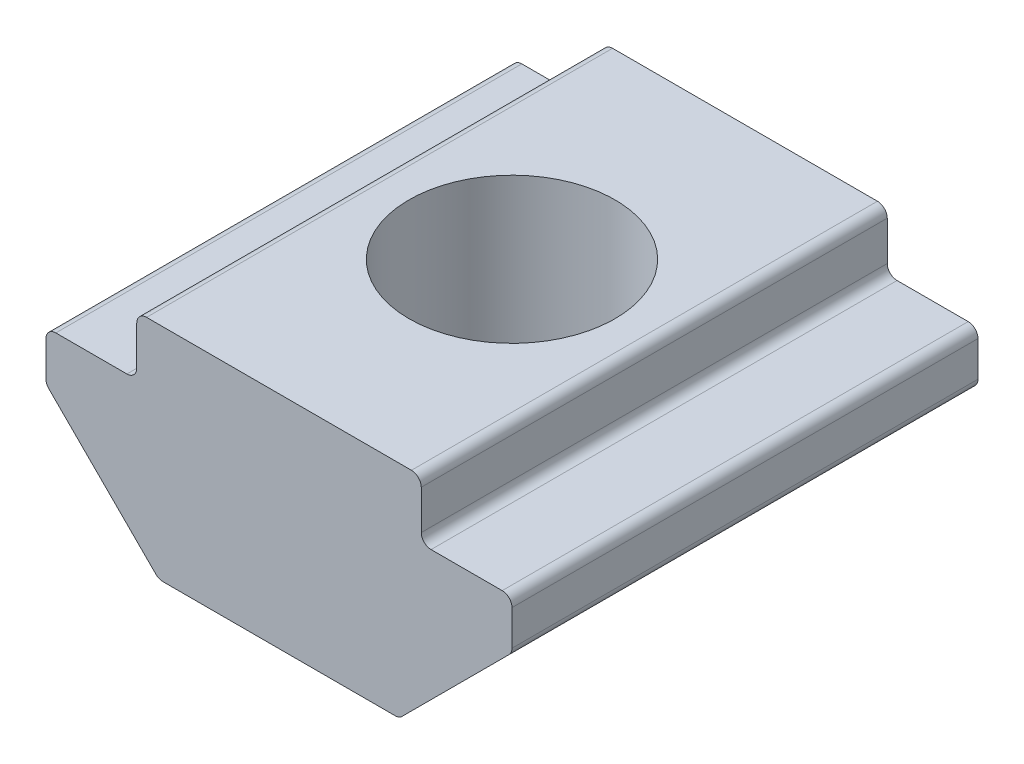
ISO-10303-21;
HEADER;
FILE_DESCRIPTION(('STEP AP214'),'2;1');
FILE_NAME('part.step','',(''),(''),'','','');
FILE_SCHEMA(('AUTOMOTIVE_DESIGN { 1 0 10303 214 1 1 1 1 }'));
ENDSEC;
DATA;
#1=APPLICATION_CONTEXT('core data for automotive mechanical design processes');
#2=APPLICATION_PROTOCOL_DEFINITION('international standard','automotive_design',2000,#1);
#3=PRODUCT_CONTEXT('',#1,'mechanical');
#4=PRODUCT('Part','Part','',(#3));
#5=PRODUCT_RELATED_PRODUCT_CATEGORY('part','',(#4));
#6=PRODUCT_DEFINITION_FORMATION('','',#4);
#7=PRODUCT_DEFINITION_CONTEXT('part definition',#1,'design');
#8=PRODUCT_DEFINITION('design','',#6,#7);
#9=PRODUCT_DEFINITION_SHAPE('','',#8);
#10=(LENGTH_UNIT() NAMED_UNIT(*) SI_UNIT(.MILLI.,.METRE.));
#11=(NAMED_UNIT(*) PLANE_ANGLE_UNIT() SI_UNIT($,.RADIAN.));
#12=(NAMED_UNIT(*) SI_UNIT($,.STERADIAN.) SOLID_ANGLE_UNIT());
#13=UNCERTAINTY_MEASURE_WITH_UNIT(LENGTH_MEASURE(1.E-05),#10,'distance_accuracy_value','');
#14=(GEOMETRIC_REPRESENTATION_CONTEXT(3) GLOBAL_UNCERTAINTY_ASSIGNED_CONTEXT((#13)) GLOBAL_UNIT_ASSIGNED_CONTEXT((#10,
#11,#12)) REPRESENTATION_CONTEXT('',''));
#15=CARTESIAN_POINT('',(0.,0.,0.));
#16=DIRECTION('',(0.,0.,1.));
#17=DIRECTION('',(1.,0.,0.));
#18=AXIS2_PLACEMENT_3D('',#15,#16,#17);
#19=CARTESIAN_POINT('',(-2.9,0.,4.75));
#20=DIRECTION('',(1.,0.,0.));
#21=DIRECTION('',(0.,1.,0.));
#22=AXIS2_PLACEMENT_3D('',#19,#20,#21);
#23=PLANE('',#22);
#24=DIRECTION('',(0.,-1.,0.));
#25=VECTOR('',#24,1.);
#26=CARTESIAN_POINT('',(-2.9,0.,-4.75));
#27=LINE('',#26,#25);
#28=CARTESIAN_POINT('',(-2.9,-0.2,-4.75));
#29=VERTEX_POINT('',#28);
#30=CARTESIAN_POINT('',(-2.9,-1.,-4.75));
#31=VERTEX_POINT('',#30);
#32=EDGE_CURVE('E183',#29,#31,#27,.T.);
#33=ORIENTED_EDGE('',*,*,#32,.T.);
#34=DIRECTION('',(0.,0.,-1.));
#35=VECTOR('',#34,1.);
#36=CARTESIAN_POINT('',(-2.9,-1.,4.75));
#37=LINE('',#36,#35);
#38=CARTESIAN_POINT('',(-2.9,-1.,4.75));
#39=VERTEX_POINT('',#38);
#40=EDGE_CURVE('E160',#31,#39,#37,.F.);
#41=ORIENTED_EDGE('',*,*,#40,.T.);
#42=DIRECTION('',(0.,-1.,0.));
#43=VECTOR('',#42,1.);
#44=CARTESIAN_POINT('',(-2.9,0.,4.75));
#45=LINE('',#44,#43);
#46=CARTESIAN_POINT('',(-2.9,-0.2,4.75));
#47=VERTEX_POINT('',#46);
#48=EDGE_CURVE('E211',#47,#39,#45,.T.);
#49=ORIENTED_EDGE('',*,*,#48,.F.);
#50=DIRECTION('',(0.,0.,-1.));
#51=VECTOR('',#50,1.);
#52=CARTESIAN_POINT('',(-2.9,-0.2,4.75));
#53=LINE('',#52,#51);
#54=EDGE_CURVE('E175',#47,#29,#53,.T.);
#55=ORIENTED_EDGE('',*,*,#54,.T.);
#56=EDGE_LOOP('',(#33,#41,#49,#55));
#57=FACE_BOUND('',#56,.T.);
#58=ADVANCED_FACE('F17',(#57),#23,.F.);
#59=CARTESIAN_POINT('',(-2.9,-1.2,4.75));
#60=DIRECTION('',(0.,-1.,0.));
#61=DIRECTION('',(1.,0.,0.));
#62=AXIS2_PLACEMENT_3D('',#59,#60,#61);
#63=PLANE('',#62);
#64=DIRECTION('',(-1.,0.,0.));
#65=VECTOR('',#64,1.);
#66=CARTESIAN_POINT('',(-2.9,-1.2,4.75));
#67=LINE('',#66,#65);
#68=CARTESIAN_POINT('',(-3.1,-1.2,4.75));
#69=VERTEX_POINT('',#68);
#70=CARTESIAN_POINT('',(-4.55,-1.2,4.75));
#71=VERTEX_POINT('',#70);
#72=EDGE_CURVE('E174',#69,#71,#67,.T.);
#73=ORIENTED_EDGE('',*,*,#72,.F.);
#74=DIRECTION('',(0.,0.,-1.));
#75=VECTOR('',#74,1.);
#76=CARTESIAN_POINT('',(-3.1,-1.2,-4.75));
#77=LINE('',#76,#75);
#78=CARTESIAN_POINT('',(-3.1,-1.2,-4.75));
#79=VERTEX_POINT('',#78);
#80=EDGE_CURVE('E159',#69,#79,#77,.T.);
#81=ORIENTED_EDGE('',*,*,#80,.T.);
#82=DIRECTION('',(-1.,0.,0.));
#83=VECTOR('',#82,1.);
#84=CARTESIAN_POINT('',(-2.9,-1.2,-4.75));
#85=LINE('',#84,#83);
#86=CARTESIAN_POINT('',(-4.55,-1.2,-4.75));
#87=VERTEX_POINT('',#86);
#88=EDGE_CURVE('E171',#79,#87,#85,.T.);
#89=ORIENTED_EDGE('',*,*,#88,.T.);
#90=DIRECTION('',(0.,0.,-1.));
#91=VECTOR('',#90,1.);
#92=CARTESIAN_POINT('',(-4.55,-1.2,4.75));
#93=LINE('',#92,#91);
#94=EDGE_CURVE('E176',#87,#71,#93,.F.);
#95=ORIENTED_EDGE('',*,*,#94,.T.);
#96=EDGE_LOOP('',(#73,#81,#89,#95));
#97=FACE_BOUND('',#96,.T.);
#98=ADVANCED_FACE('F170',(#97),#63,.F.);
#99=CARTESIAN_POINT('',(-4.75,-1.2,4.75));
#100=DIRECTION('',(1.,0.,0.));
#101=DIRECTION('',(0.,0.,-1.));
#102=AXIS2_PLACEMENT_3D('',#99,#100,#101);
#103=PLANE('',#102);
#104=DIRECTION('',(0.,-1.,0.));
#105=VECTOR('',#104,1.);
#106=CARTESIAN_POINT('',(-4.75,-1.2,-4.75));
#107=LINE('',#106,#105);
#108=CARTESIAN_POINT('',(-4.75,-1.4,-4.75));
#109=VERTEX_POINT('',#108);
#110=CARTESIAN_POINT('',(-4.75,-2.11715728752538,-4.75));
#111=VERTEX_POINT('',#110);
#112=EDGE_CURVE('E182',#109,#111,#107,.T.);
#113=ORIENTED_EDGE('',*,*,#112,.T.);
#114=DIRECTION('',(0.,0.,-1.));
#115=VECTOR('',#114,1.);
#116=CARTESIAN_POINT('',(-4.75,-2.11715728752538,4.75));
#117=LINE('',#116,#115);
#118=CARTESIAN_POINT('',(-4.75,-2.11715728752538,4.75));
#119=VERTEX_POINT('',#118);
#120=EDGE_CURVE('E250',#111,#119,#117,.F.);
#121=ORIENTED_EDGE('',*,*,#120,.T.);
#122=DIRECTION('',(0.,-1.,0.));
#123=VECTOR('',#122,1.);
#124=CARTESIAN_POINT('',(-4.75,-1.2,4.75));
#125=LINE('',#124,#123);
#126=CARTESIAN_POINT('',(-4.75,-1.4,4.75));
#127=VERTEX_POINT('',#126);
#128=EDGE_CURVE('E321',#127,#119,#125,.T.);
#129=ORIENTED_EDGE('',*,*,#128,.F.);
#130=DIRECTION('',(0.,0.,-1.));
#131=VECTOR('',#130,1.);
#132=CARTESIAN_POINT('',(-4.75,-1.4,4.75));
#133=LINE('',#132,#131);
#134=EDGE_CURVE('E247',#127,#109,#133,.T.);
#135=ORIENTED_EDGE('',*,*,#134,.T.);
#136=EDGE_LOOP('',(#113,#121,#129,#135));
#137=FACE_BOUND('',#136,.T.);
#138=ADVANCED_FACE('F352',(#137),#103,.F.);
#139=CARTESIAN_POINT('',(-4.75,-2.2,4.75));
#140=DIRECTION('',(0.707106781186546,0.707106781186549,0.));
#141=DIRECTION('',(-0.707106781186549,0.707106781186546,0.));
#142=AXIS2_PLACEMENT_3D('',#139,#140,#141);
#143=PLANE('',#142);
#144=DIRECTION('',(0.707106781186549,-0.707106781186546,0.));
#145=VECTOR('',#144,1.);
#146=CARTESIAN_POINT('',(-4.75,-2.2,4.75));
#147=LINE('',#146,#145);
#148=CARTESIAN_POINT('',(-4.69142135623731,-2.25857864376269,4.75));
#149=VERTEX_POINT('',#148);
#150=CARTESIAN_POINT('',(-2.50857864376268,-4.44142135623731,4.75));
#151=VERTEX_POINT('',#150);
#152=EDGE_CURVE('E318',#149,#151,#147,.T.);
#153=ORIENTED_EDGE('',*,*,#152,.F.);
#154=DIRECTION('',(0.,0.,-1.));
#155=VECTOR('',#154,1.);
#156=CARTESIAN_POINT('',(-4.69142135623731,-2.25857864376269,4.75));
#157=LINE('',#156,#155);
#158=CARTESIAN_POINT('',(-4.69142135623731,-2.25857864376269,-4.75));
#159=VERTEX_POINT('',#158);
#160=EDGE_CURVE('E229',#149,#159,#157,.T.);
#161=ORIENTED_EDGE('',*,*,#160,.T.);
#162=DIRECTION('',(0.707106781186549,-0.707106781186546,0.));
#163=VECTOR('',#162,1.);
#164=CARTESIAN_POINT('',(-4.75,-2.2,-4.75));
#165=LINE('',#164,#163);
#166=CARTESIAN_POINT('',(-2.50857864376268,-4.44142135623731,-4.75));
#167=VERTEX_POINT('',#166);
#168=EDGE_CURVE('E186',#159,#167,#165,.T.);
#169=ORIENTED_EDGE('',*,*,#168,.T.);
#170=DIRECTION('',(0.,0.,-1.));
#171=VECTOR('',#170,1.);
#172=CARTESIAN_POINT('',(-2.50857864376268,-4.44142135623731,4.75));
#173=LINE('',#172,#171);
#174=EDGE_CURVE('E227',#167,#151,#173,.F.);
#175=ORIENTED_EDGE('',*,*,#174,.T.);
#176=EDGE_LOOP('',(#153,#161,#169,#175));
#177=FACE_BOUND('',#176,.T.);
#178=ADVANCED_FACE('F528',(#177),#143,.F.);
#179=CARTESIAN_POINT('',(-2.45,-4.5,4.75));
#180=DIRECTION('',(0.,1.,0.));
#181=DIRECTION('',(-1.,0.,0.));
#182=AXIS2_PLACEMENT_3D('',#179,#180,#181);
#183=PLANE('',#182);
#184=CARTESIAN_POINT('',(0.,-4.5,0.));
#185=DIRECTION('',(0.,1.,0.));
#186=DIRECTION('',(0.,0.,1.));
#187=AXIS2_PLACEMENT_3D('',#184,#185,#186);
#188=CIRCLE('',#187,2.1);
#189=CARTESIAN_POINT('',(0.,-4.5,2.1));
#190=VERTEX_POINT('',#189);
#191=EDGE_CURVE('E188',#190,#190,#188,.T.);
#192=ORIENTED_EDGE('',*,*,#191,.T.);
#193=EDGE_LOOP('',(#192));
#194=FACE_BOUND('',#193,.T.);
#195=DIRECTION('',(1.,0.,0.));
#196=VECTOR('',#195,1.);
#197=CARTESIAN_POINT('',(-2.45,-4.5,4.75));
#198=LINE('',#197,#196);
#199=CARTESIAN_POINT('',(-2.36715728752537,-4.5,4.75));
#200=VERTEX_POINT('',#199);
#201=CARTESIAN_POINT('',(2.36715728752537,-4.5,4.75));
#202=VERTEX_POINT('',#201);
#203=EDGE_CURVE('E315',#200,#202,#198,.T.);
#204=ORIENTED_EDGE('',*,*,#203,.F.);
#205=DIRECTION('',(0.,0.,-1.));
#206=VECTOR('',#205,1.);
#207=CARTESIAN_POINT('',(-2.36715728752537,-4.5,4.75));
#208=LINE('',#207,#206);
#209=CARTESIAN_POINT('',(-2.36715728752537,-4.5,-4.75));
#210=VERTEX_POINT('',#209);
#211=EDGE_CURVE('E269',#200,#210,#208,.T.);
#212=ORIENTED_EDGE('',*,*,#211,.T.);
#213=DIRECTION('',(1.,0.,0.));
#214=VECTOR('',#213,1.);
#215=CARTESIAN_POINT('',(-2.45,-4.5,-4.75));
#216=LINE('',#215,#214);
#217=CARTESIAN_POINT('',(2.36715728752537,-4.5,-4.75));
#218=VERTEX_POINT('',#217);
#219=EDGE_CURVE('E194',#210,#218,#216,.T.);
#220=ORIENTED_EDGE('',*,*,#219,.T.);
#221=DIRECTION('',(0.,0.,-1.));
#222=VECTOR('',#221,1.);
#223=CARTESIAN_POINT('',(2.36715728752537,-4.5,4.75));
#224=LINE('',#223,#222);
#225=EDGE_CURVE('E267',#218,#202,#224,.F.);
#226=ORIENTED_EDGE('',*,*,#225,.T.);
#227=EDGE_LOOP('',(#204,#212,#220,#226));
#228=FACE_BOUND('',#227,.T.);
#229=ADVANCED_FACE('F518',(#194,#228),#183,.F.);
#230=CARTESIAN_POINT('',(4.75,-2.2,4.75));
#231=DIRECTION('',(-0.707106781186546,0.707106781186549,0.));
#232=DIRECTION('',(-0.707106781186549,-0.707106781186546,0.));
#233=AXIS2_PLACEMENT_3D('',#230,#231,#232);
#234=PLANE('',#233);
#235=DIRECTION('',(0.707106781186549,0.707106781186546,0.));
#236=VECTOR('',#235,1.);
#237=CARTESIAN_POINT('',(4.75,-2.2,4.75));
#238=LINE('',#237,#236);
#239=CARTESIAN_POINT('',(2.50857864376268,-4.44142135623731,4.75));
#240=VERTEX_POINT('',#239);
#241=CARTESIAN_POINT('',(4.69142135623731,-2.25857864376269,4.75));
#242=VERTEX_POINT('',#241);
#243=EDGE_CURVE('E312',#240,#242,#238,.T.);
#244=ORIENTED_EDGE('',*,*,#243,.F.);
#245=DIRECTION('',(0.,0.,-1.));
#246=VECTOR('',#245,1.);
#247=CARTESIAN_POINT('',(2.50857864376268,-4.44142135623731,4.75));
#248=LINE('',#247,#246);
#249=CARTESIAN_POINT('',(2.50857864376268,-4.44142135623731,-4.75));
#250=VERTEX_POINT('',#249);
#251=EDGE_CURVE('E274',#240,#250,#248,.T.);
#252=ORIENTED_EDGE('',*,*,#251,.T.);
#253=DIRECTION('',(0.707106781186549,0.707106781186546,0.));
#254=VECTOR('',#253,1.);
#255=CARTESIAN_POINT('',(4.75,-2.2,-4.75));
#256=LINE('',#255,#254);
#257=CARTESIAN_POINT('',(4.69142135623731,-2.25857864376269,-4.75));
#258=VERTEX_POINT('',#257);
#259=EDGE_CURVE('E197',#250,#258,#256,.T.);
#260=ORIENTED_EDGE('',*,*,#259,.T.);
#261=DIRECTION('',(0.,0.,-1.));
#262=VECTOR('',#261,1.);
#263=CARTESIAN_POINT('',(4.69142135623731,-2.25857864376269,4.75));
#264=LINE('',#263,#262);
#265=EDGE_CURVE('E272',#258,#242,#264,.F.);
#266=ORIENTED_EDGE('',*,*,#265,.T.);
#267=EDGE_LOOP('',(#244,#252,#260,#266));
#268=FACE_BOUND('',#267,.T.);
#269=ADVANCED_FACE('F508',(#268),#234,.F.);
#270=CARTESIAN_POINT('',(4.75,-1.2,4.75));
#271=DIRECTION('',(-1.,0.,0.));
#272=DIRECTION('',(0.,0.,1.));
#273=AXIS2_PLACEMENT_3D('',#270,#271,#272);
#274=PLANE('',#273);
#275=DIRECTION('',(0.,1.,0.));
#276=VECTOR('',#275,1.);
#277=CARTESIAN_POINT('',(4.75,-1.2,4.75));
#278=LINE('',#277,#276);
#279=CARTESIAN_POINT('',(4.75,-2.11715728752538,4.75));
#280=VERTEX_POINT('',#279);
#281=CARTESIAN_POINT('',(4.75,-1.4,4.75));
#282=VERTEX_POINT('',#281);
#283=EDGE_CURVE('E307',#280,#282,#278,.T.);
#284=ORIENTED_EDGE('',*,*,#283,.F.);
#285=DIRECTION('',(0.,0.,-1.));
#286=VECTOR('',#285,1.);
#287=CARTESIAN_POINT('',(4.75,-2.11715728752538,4.75));
#288=LINE('',#287,#286);
#289=CARTESIAN_POINT('',(4.75,-2.11715728752538,-4.75));
#290=VERTEX_POINT('',#289);
#291=EDGE_CURVE('E279',#280,#290,#288,.T.);
#292=ORIENTED_EDGE('',*,*,#291,.T.);
#293=DIRECTION('',(0.,1.,0.));
#294=VECTOR('',#293,1.);
#295=CARTESIAN_POINT('',(4.75,-1.2,-4.75));
#296=LINE('',#295,#294);
#297=CARTESIAN_POINT('',(4.75,-1.4,-4.75));
#298=VERTEX_POINT('',#297);
#299=EDGE_CURVE('E200',#290,#298,#296,.T.);
#300=ORIENTED_EDGE('',*,*,#299,.T.);
#301=DIRECTION('',(0.,0.,-1.));
#302=VECTOR('',#301,1.);
#303=CARTESIAN_POINT('',(4.75,-1.4,4.75));
#304=LINE('',#303,#302);
#305=EDGE_CURVE('E277',#298,#282,#304,.F.);
#306=ORIENTED_EDGE('',*,*,#305,.T.);
#307=EDGE_LOOP('',(#284,#292,#300,#306));
#308=FACE_BOUND('',#307,.T.);
#309=ADVANCED_FACE('F499',(#308),#274,.F.);
#310=CARTESIAN_POINT('',(2.9,-1.2,4.75));
#311=DIRECTION('',(0.,-1.,0.));
#312=DIRECTION('',(1.,0.,0.));
#313=AXIS2_PLACEMENT_3D('',#310,#311,#312);
#314=PLANE('',#313);
#315=DIRECTION('',(-1.,0.,0.));
#316=VECTOR('',#315,1.);
#317=CARTESIAN_POINT('',(2.9,-1.2,-4.75));
#318=LINE('',#317,#316);
#319=CARTESIAN_POINT('',(4.55,-1.2,-4.75));
#320=VERTEX_POINT('',#319);
#321=CARTESIAN_POINT('',(3.1,-1.2,-4.75));
#322=VERTEX_POINT('',#321);
#323=EDGE_CURVE('E203',#320,#322,#318,.T.);
#324=ORIENTED_EDGE('',*,*,#323,.T.);
#325=DIRECTION('',(0.,0.,-1.));
#326=VECTOR('',#325,1.);
#327=CARTESIAN_POINT('',(3.1,-1.2,4.75));
#328=LINE('',#327,#326);
#329=CARTESIAN_POINT('',(3.1,-1.2,4.75));
#330=VERTEX_POINT('',#329);
#331=EDGE_CURVE('E225',#322,#330,#328,.F.);
#332=ORIENTED_EDGE('',*,*,#331,.T.);
#333=DIRECTION('',(-1.,0.,0.));
#334=VECTOR('',#333,1.);
#335=CARTESIAN_POINT('',(2.9,-1.2,4.75));
#336=LINE('',#335,#334);
#337=CARTESIAN_POINT('',(4.55,-1.2,4.75));
#338=VERTEX_POINT('',#337);
#339=EDGE_CURVE('E302',#338,#330,#336,.T.);
#340=ORIENTED_EDGE('',*,*,#339,.F.);
#341=DIRECTION('',(0.,0.,-1.));
#342=VECTOR('',#341,1.);
#343=CARTESIAN_POINT('',(4.55,-1.2,4.75));
#344=LINE('',#343,#342);
#345=EDGE_CURVE('E222',#338,#320,#344,.T.);
#346=ORIENTED_EDGE('',*,*,#345,.T.);
#347=EDGE_LOOP('',(#324,#332,#340,#346));
#348=FACE_BOUND('',#347,.T.);
#349=ADVANCED_FACE('F292',(#348),#314,.F.);
#350=CARTESIAN_POINT('',(2.9,0.,4.75));
#351=DIRECTION('',(-1.,0.,0.));
#352=DIRECTION('',(0.,-1.,0.));
#353=AXIS2_PLACEMENT_3D('',#350,#351,#352);
#354=PLANE('',#353);
#355=DIRECTION('',(0.,1.,0.));
#356=VECTOR('',#355,1.);
#357=CARTESIAN_POINT('',(2.9,0.,4.75));
#358=LINE('',#357,#356);
#359=CARTESIAN_POINT('',(2.9,-1.,4.75));
#360=VERTEX_POINT('',#359);
#361=CARTESIAN_POINT('',(2.9,-0.2,4.75));
#362=VERTEX_POINT('',#361);
#363=EDGE_CURVE('E301',#360,#362,#358,.T.);
#364=ORIENTED_EDGE('',*,*,#363,.F.);
#365=DIRECTION('',(0.,0.,-1.));
#366=VECTOR('',#365,1.);
#367=CARTESIAN_POINT('',(2.9,-1.,-4.75));
#368=LINE('',#367,#366);
#369=CARTESIAN_POINT('',(2.9,-1.,-4.75));
#370=VERTEX_POINT('',#369);
#371=EDGE_CURVE('E219',#360,#370,#368,.T.);
#372=ORIENTED_EDGE('',*,*,#371,.T.);
#373=DIRECTION('',(0.,1.,0.));
#374=VECTOR('',#373,1.);
#375=CARTESIAN_POINT('',(2.9,0.,-4.75));
#376=LINE('',#375,#374);
#377=CARTESIAN_POINT('',(2.9,-0.2,-4.75));
#378=VERTEX_POINT('',#377);
#379=EDGE_CURVE('E206',#370,#378,#376,.T.);
#380=ORIENTED_EDGE('',*,*,#379,.T.);
#381=DIRECTION('',(0.,0.,-1.));
#382=VECTOR('',#381,1.);
#383=CARTESIAN_POINT('',(2.9,-0.2,4.75));
#384=LINE('',#383,#382);
#385=EDGE_CURVE('E217',#378,#362,#384,.F.);
#386=ORIENTED_EDGE('',*,*,#385,.T.);
#387=EDGE_LOOP('',(#364,#372,#380,#386));
#388=FACE_BOUND('',#387,.T.);
#389=ADVANCED_FACE('F304',(#388),#354,.F.);
#390=CARTESIAN_POINT('',(-2.9,0.,4.75));
#391=DIRECTION('',(0.,-1.,0.));
#392=DIRECTION('',(0.,0.,-1.));
#393=AXIS2_PLACEMENT_3D('',#390,#391,#392);
#394=PLANE('',#393);
#395=CARTESIAN_POINT('',(0.,0.,0.));
#396=DIRECTION('',(0.,1.,0.));
#397=DIRECTION('',(0.,0.,1.));
#398=AXIS2_PLACEMENT_3D('',#395,#396,#397);
#399=CIRCLE('',#398,2.1);
#400=CARTESIAN_POINT('',(0.,0.,2.1));
#401=VERTEX_POINT('',#400);
#402=EDGE_CURVE('E328',#401,#401,#399,.T.);
#403=ORIENTED_EDGE('',*,*,#402,.F.);
#404=EDGE_LOOP('',(#403));
#405=FACE_BOUND('',#404,.T.);
#406=DIRECTION('',(-1.,0.,0.));
#407=VECTOR('',#406,1.);
#408=CARTESIAN_POINT('',(-2.9,0.,-4.75));
#409=LINE('',#408,#407);
#410=CARTESIAN_POINT('',(2.7,0.,-4.75));
#411=VERTEX_POINT('',#410);
#412=CARTESIAN_POINT('',(-2.7,0.,-4.75));
#413=VERTEX_POINT('',#412);
#414=EDGE_CURVE('E209',#411,#413,#409,.T.);
#415=ORIENTED_EDGE('',*,*,#414,.T.);
#416=DIRECTION('',(0.,0.,-1.));
#417=VECTOR('',#416,1.);
#418=CARTESIAN_POINT('',(-2.7,0.,4.75));
#419=LINE('',#418,#417);
#420=CARTESIAN_POINT('',(-2.7,0.,4.75));
#421=VERTEX_POINT('',#420);
#422=EDGE_CURVE('E32',#413,#421,#419,.F.);
#423=ORIENTED_EDGE('',*,*,#422,.T.);
#424=DIRECTION('',(-1.,0.,0.));
#425=VECTOR('',#424,1.);
#426=CARTESIAN_POINT('',(-2.9,0.,4.75));
#427=LINE('',#426,#425);
#428=CARTESIAN_POINT('',(2.7,0.,4.75));
#429=VERTEX_POINT('',#428);
#430=EDGE_CURVE('E212',#429,#421,#427,.T.);
#431=ORIENTED_EDGE('',*,*,#430,.F.);
#432=DIRECTION('',(0.,0.,-1.));
#433=VECTOR('',#432,1.);
#434=CARTESIAN_POINT('',(2.7,0.,4.75));
#435=LINE('',#434,#433);
#436=EDGE_CURVE('E282',#429,#411,#435,.T.);
#437=ORIENTED_EDGE('',*,*,#436,.T.);
#438=EDGE_LOOP('',(#415,#423,#431,#437));
#439=FACE_BOUND('',#438,.T.);
#440=ADVANCED_FACE('F334',(#405,#439),#394,.F.);
#441=CARTESIAN_POINT('',(0.,0.,4.75));
#442=DIRECTION('',(0.,0.,-1.));
#443=DIRECTION('',(-1.,0.,0.));
#444=AXIS2_PLACEMENT_3D('',#441,#442,#443);
#445=PLANE('',#444);
#446=ORIENTED_EDGE('',*,*,#128,.T.);
#447=CARTESIAN_POINT('',(-4.55,-2.11715728752538,4.75));
#448=DIRECTION('',(0.,0.,-1.));
#449=DIRECTION('',(-1.,0.,0.));
#450=AXIS2_PLACEMENT_3D('',#447,#448,#449);
#451=CIRCLE('',#450,0.2);
#452=EDGE_CURVE('E265',#119,#149,#451,.F.);
#453=ORIENTED_EDGE('',*,*,#452,.T.);
#454=ORIENTED_EDGE('',*,*,#152,.T.);
#455=CARTESIAN_POINT('',(-2.36715728752537,-4.3,4.75));
#456=DIRECTION('',(0.,0.,-1.));
#457=DIRECTION('',(-1.,0.,0.));
#458=AXIS2_PLACEMENT_3D('',#455,#456,#457);
#459=CIRCLE('',#458,0.2);
#460=EDGE_CURVE('E263',#151,#200,#459,.F.);
#461=ORIENTED_EDGE('',*,*,#460,.T.);
#462=ORIENTED_EDGE('',*,*,#203,.T.);
#463=CARTESIAN_POINT('',(2.36715728752537,-4.3,4.75));
#464=DIRECTION('',(0.,0.,-1.));
#465=DIRECTION('',(-1.,0.,0.));
#466=AXIS2_PLACEMENT_3D('',#463,#464,#465);
#467=CIRCLE('',#466,0.2);
#468=EDGE_CURVE('E261',#202,#240,#467,.F.);
#469=ORIENTED_EDGE('',*,*,#468,.T.);
#470=ORIENTED_EDGE('',*,*,#243,.T.);
#471=CARTESIAN_POINT('',(4.55,-2.11715728752538,4.75));
#472=DIRECTION('',(0.,0.,-1.));
#473=DIRECTION('',(-1.,0.,0.));
#474=AXIS2_PLACEMENT_3D('',#471,#472,#473);
#475=CIRCLE('',#474,0.2);
#476=EDGE_CURVE('E259',#242,#280,#475,.F.);
#477=ORIENTED_EDGE('',*,*,#476,.T.);
#478=ORIENTED_EDGE('',*,*,#283,.T.);
#479=CARTESIAN_POINT('',(4.55,-1.4,4.75));
#480=DIRECTION('',(0.,0.,-1.));
#481=DIRECTION('',(-1.,0.,0.));
#482=AXIS2_PLACEMENT_3D('',#479,#480,#481);
#483=CIRCLE('',#482,0.2);
#484=EDGE_CURVE('E257',#282,#338,#483,.F.);
#485=ORIENTED_EDGE('',*,*,#484,.T.);
#486=ORIENTED_EDGE('',*,*,#339,.T.);
#487=CARTESIAN_POINT('',(3.1,-1.,4.75));
#488=DIRECTION('',(0.,0.,-1.));
#489=DIRECTION('',(-1.,0.,0.));
#490=AXIS2_PLACEMENT_3D('',#487,#488,#489);
#491=CIRCLE('',#490,0.2);
#492=EDGE_CURVE('E11',#330,#360,#491,.T.);
#493=ORIENTED_EDGE('',*,*,#492,.T.);
#494=ORIENTED_EDGE('',*,*,#363,.T.);
#495=CARTESIAN_POINT('',(2.7,-0.2,4.75));
#496=DIRECTION('',(0.,0.,-1.));
#497=DIRECTION('',(-1.,0.,0.));
#498=AXIS2_PLACEMENT_3D('',#495,#496,#497);
#499=CIRCLE('',#498,0.2);
#500=EDGE_CURVE('E39',#362,#429,#499,.F.);
#501=ORIENTED_EDGE('',*,*,#500,.T.);
#502=ORIENTED_EDGE('',*,*,#430,.T.);
#503=CARTESIAN_POINT('',(-2.7,-0.2,4.75));
#504=DIRECTION('',(0.,0.,-1.));
#505=DIRECTION('',(-1.,0.,0.));
#506=AXIS2_PLACEMENT_3D('',#503,#504,#505);
#507=CIRCLE('',#506,0.2);
#508=EDGE_CURVE('E253',#421,#47,#507,.F.);
#509=ORIENTED_EDGE('',*,*,#508,.T.);
#510=ORIENTED_EDGE('',*,*,#48,.T.);
#511=CARTESIAN_POINT('',(-3.1,-1.,4.75));
#512=DIRECTION('',(0.,0.,-1.));
#513=DIRECTION('',(-1.,0.,0.));
#514=AXIS2_PLACEMENT_3D('',#511,#512,#513);
#515=CIRCLE('',#514,0.2);
#516=EDGE_CURVE('E165',#39,#69,#515,.T.);
#517=ORIENTED_EDGE('',*,*,#516,.T.);
#518=ORIENTED_EDGE('',*,*,#72,.T.);
#519=CARTESIAN_POINT('',(-4.55,-1.4,4.75));
#520=DIRECTION('',(0.,0.,-1.));
#521=DIRECTION('',(-1.,0.,0.));
#522=AXIS2_PLACEMENT_3D('',#519,#520,#521);
#523=CIRCLE('',#522,0.2);
#524=EDGE_CURVE('E255',#71,#127,#523,.F.);
#525=ORIENTED_EDGE('',*,*,#524,.T.);
#526=EDGE_LOOP('',(#446,#453,#454,#461,#462,#469,#470,#477,#478,#485,#486,#493,#494,#501,#502,
#509,#510,#517,#518,#525));
#527=FACE_BOUND('',#526,.T.);
#528=ADVANCED_FACE('F300',(#527),#445,.F.);
#529=CARTESIAN_POINT('',(0.,0.,-4.75));
#530=DIRECTION('',(0.,0.,-1.));
#531=DIRECTION('',(-1.,0.,0.));
#532=AXIS2_PLACEMENT_3D('',#529,#530,#531);
#533=PLANE('',#532);
#534=ORIENTED_EDGE('',*,*,#168,.F.);
#535=CARTESIAN_POINT('',(-4.55,-2.11715728752538,-4.75));
#536=DIRECTION('',(0.,0.,-1.));
#537=DIRECTION('',(-1.,0.,0.));
#538=AXIS2_PLACEMENT_3D('',#535,#536,#537);
#539=CIRCLE('',#538,0.2);
#540=EDGE_CURVE('E245',#159,#111,#539,.T.);
#541=ORIENTED_EDGE('',*,*,#540,.T.);
#542=ORIENTED_EDGE('',*,*,#112,.F.);
#543=CARTESIAN_POINT('',(-4.55,-1.4,-4.75));
#544=DIRECTION('',(0.,0.,-1.));
#545=DIRECTION('',(-1.,0.,0.));
#546=AXIS2_PLACEMENT_3D('',#543,#544,#545);
#547=CIRCLE('',#546,0.2);
#548=EDGE_CURVE('E181',#109,#87,#547,.T.);
#549=ORIENTED_EDGE('',*,*,#548,.T.);
#550=ORIENTED_EDGE('',*,*,#88,.F.);
#551=CARTESIAN_POINT('',(-3.1,-1.,-4.75));
#552=DIRECTION('',(0.,0.,-1.));
#553=DIRECTION('',(-1.,0.,0.));
#554=AXIS2_PLACEMENT_3D('',#551,#552,#553);
#555=CIRCLE('',#554,0.2);
#556=EDGE_CURVE('E155',#79,#31,#555,.F.);
#557=ORIENTED_EDGE('',*,*,#556,.T.);
#558=ORIENTED_EDGE('',*,*,#32,.F.);
#559=CARTESIAN_POINT('',(-2.7,-0.2,-4.75));
#560=DIRECTION('',(0.,0.,-1.));
#561=DIRECTION('',(-1.,0.,0.));
#562=AXIS2_PLACEMENT_3D('',#559,#560,#561);
#563=CIRCLE('',#562,0.2);
#564=EDGE_CURVE('E234',#29,#413,#563,.T.);
#565=ORIENTED_EDGE('',*,*,#564,.T.);
#566=ORIENTED_EDGE('',*,*,#414,.F.);
#567=CARTESIAN_POINT('',(2.7,-0.2,-4.75));
#568=DIRECTION('',(0.,0.,-1.));
#569=DIRECTION('',(-1.,0.,0.));
#570=AXIS2_PLACEMENT_3D('',#567,#568,#569);
#571=CIRCLE('',#570,0.2);
#572=EDGE_CURVE('E232',#411,#378,#571,.T.);
#573=ORIENTED_EDGE('',*,*,#572,.T.);
#574=ORIENTED_EDGE('',*,*,#379,.F.);
#575=CARTESIAN_POINT('',(3.1,-1.,-4.75));
#576=DIRECTION('',(0.,0.,-1.));
#577=DIRECTION('',(-1.,0.,0.));
#578=AXIS2_PLACEMENT_3D('',#575,#576,#577);
#579=CIRCLE('',#578,0.2);
#580=EDGE_CURVE('E25',#370,#322,#579,.F.);
#581=ORIENTED_EDGE('',*,*,#580,.T.);
#582=ORIENTED_EDGE('',*,*,#323,.F.);
#583=CARTESIAN_POINT('',(4.55,-1.4,-4.75));
#584=DIRECTION('',(0.,0.,-1.));
#585=DIRECTION('',(-1.,0.,0.));
#586=AXIS2_PLACEMENT_3D('',#583,#584,#585);
#587=CIRCLE('',#586,0.2);
#588=EDGE_CURVE('E237',#320,#298,#587,.T.);
#589=ORIENTED_EDGE('',*,*,#588,.T.);
#590=ORIENTED_EDGE('',*,*,#299,.F.);
#591=CARTESIAN_POINT('',(4.55,-2.11715728752538,-4.75));
#592=DIRECTION('',(0.,0.,-1.));
#593=DIRECTION('',(-1.,0.,0.));
#594=AXIS2_PLACEMENT_3D('',#591,#592,#593);
#595=CIRCLE('',#594,0.2);
#596=EDGE_CURVE('E239',#290,#258,#595,.T.);
#597=ORIENTED_EDGE('',*,*,#596,.T.);
#598=ORIENTED_EDGE('',*,*,#259,.F.);
#599=CARTESIAN_POINT('',(2.36715728752537,-4.3,-4.75));
#600=DIRECTION('',(0.,0.,-1.));
#601=DIRECTION('',(-1.,0.,0.));
#602=AXIS2_PLACEMENT_3D('',#599,#600,#601);
#603=CIRCLE('',#602,0.2);
#604=EDGE_CURVE('E241',#250,#218,#603,.T.);
#605=ORIENTED_EDGE('',*,*,#604,.T.);
#606=ORIENTED_EDGE('',*,*,#219,.F.);
#607=CARTESIAN_POINT('',(-2.36715728752537,-4.3,-4.75));
#608=DIRECTION('',(0.,0.,-1.));
#609=DIRECTION('',(-1.,0.,0.));
#610=AXIS2_PLACEMENT_3D('',#607,#608,#609);
#611=CIRCLE('',#610,0.2);
#612=EDGE_CURVE('E243',#210,#167,#611,.T.);
#613=ORIENTED_EDGE('',*,*,#612,.T.);
#614=EDGE_LOOP('',(#534,#541,#542,#549,#550,#557,#558,#565,#566,#573,#574,#581,#582,#589,#590,
#597,#598,#605,#606,#613));
#615=FACE_BOUND('',#614,.T.);
#616=ADVANCED_FACE('F179',(#615),#533,.T.);
#617=CARTESIAN_POINT('',(0.,0.,0.));
#618=DIRECTION('',(0.,1.,0.));
#619=DIRECTION('',(0.,0.,1.));
#620=AXIS2_PLACEMENT_3D('',#617,#618,#619);
#621=CYLINDRICAL_SURFACE('',#620,2.1);
#622=ORIENTED_EDGE('',*,*,#191,.F.);
#623=EDGE_LOOP('',(#622));
#624=FACE_BOUND('',#623,.T.);
#625=ORIENTED_EDGE('',*,*,#402,.T.);
#626=EDGE_LOOP('',(#625));
#627=FACE_BOUND('',#626,.T.);
#628=ADVANCED_FACE('F332',(#624,#627),#621,.F.);
#629=CARTESIAN_POINT('',(-3.1,-1.,4.75));
#630=DIRECTION('',(0.,0.,1.));
#631=DIRECTION('',(1.,0.,0.));
#632=AXIS2_PLACEMENT_3D('',#629,#630,#631);
#633=CYLINDRICAL_SURFACE('',#632,0.2);
#634=ORIENTED_EDGE('',*,*,#516,.F.);
#635=ORIENTED_EDGE('',*,*,#40,.F.);
#636=ORIENTED_EDGE('',*,*,#556,.F.);
#637=ORIENTED_EDGE('',*,*,#80,.F.);
#638=EDGE_LOOP('',(#634,#635,#636,#637));
#639=FACE_BOUND('',#638,.T.);
#640=ADVANCED_FACE('F158',(#639),#633,.F.);
#641=CARTESIAN_POINT('',(3.1,-1.,4.75));
#642=DIRECTION('',(0.,0.,1.));
#643=DIRECTION('',(1.,0.,0.));
#644=AXIS2_PLACEMENT_3D('',#641,#642,#643);
#645=CYLINDRICAL_SURFACE('',#644,0.2);
#646=ORIENTED_EDGE('',*,*,#492,.F.);
#647=ORIENTED_EDGE('',*,*,#331,.F.);
#648=ORIENTED_EDGE('',*,*,#580,.F.);
#649=ORIENTED_EDGE('',*,*,#371,.F.);
#650=EDGE_LOOP('',(#646,#647,#648,#649));
#651=FACE_BOUND('',#650,.T.);
#652=ADVANCED_FACE('F297',(#651),#645,.F.);
#653=CARTESIAN_POINT('',(-4.55,-2.11715728752538,4.75));
#654=DIRECTION('',(0.,0.,-1.));
#655=DIRECTION('',(-1.,0.,0.));
#656=AXIS2_PLACEMENT_3D('',#653,#654,#655);
#657=CYLINDRICAL_SURFACE('',#656,0.2);
#658=ORIENTED_EDGE('',*,*,#452,.F.);
#659=ORIENTED_EDGE('',*,*,#120,.F.);
#660=ORIENTED_EDGE('',*,*,#540,.F.);
#661=ORIENTED_EDGE('',*,*,#160,.F.);
#662=EDGE_LOOP('',(#658,#659,#660,#661));
#663=FACE_BOUND('',#662,.T.);
#664=ADVANCED_FACE('F360',(#663),#657,.T.);
#665=CARTESIAN_POINT('',(-2.36715728752537,-4.3,4.75));
#666=DIRECTION('',(0.,0.,-1.));
#667=DIRECTION('',(-1.,0.,0.));
#668=AXIS2_PLACEMENT_3D('',#665,#666,#667);
#669=CYLINDRICAL_SURFACE('',#668,0.2);
#670=ORIENTED_EDGE('',*,*,#460,.F.);
#671=ORIENTED_EDGE('',*,*,#174,.F.);
#672=ORIENTED_EDGE('',*,*,#612,.F.);
#673=ORIENTED_EDGE('',*,*,#211,.F.);
#674=EDGE_LOOP('',(#670,#671,#672,#673));
#675=FACE_BOUND('',#674,.T.);
#676=ADVANCED_FACE('F363',(#675),#669,.T.);
#677=CARTESIAN_POINT('',(2.36715728752537,-4.3,4.75));
#678=DIRECTION('',(0.,0.,-1.));
#679=DIRECTION('',(-1.,0.,0.));
#680=AXIS2_PLACEMENT_3D('',#677,#678,#679);
#681=CYLINDRICAL_SURFACE('',#680,0.2);
#682=ORIENTED_EDGE('',*,*,#468,.F.);
#683=ORIENTED_EDGE('',*,*,#225,.F.);
#684=ORIENTED_EDGE('',*,*,#604,.F.);
#685=ORIENTED_EDGE('',*,*,#251,.F.);
#686=EDGE_LOOP('',(#682,#683,#684,#685));
#687=FACE_BOUND('',#686,.T.);
#688=ADVANCED_FACE('F367',(#687),#681,.T.);
#689=CARTESIAN_POINT('',(4.55,-2.11715728752538,4.75));
#690=DIRECTION('',(0.,0.,-1.));
#691=DIRECTION('',(-1.,0.,0.));
#692=AXIS2_PLACEMENT_3D('',#689,#690,#691);
#693=CYLINDRICAL_SURFACE('',#692,0.2);
#694=ORIENTED_EDGE('',*,*,#476,.F.);
#695=ORIENTED_EDGE('',*,*,#265,.F.);
#696=ORIENTED_EDGE('',*,*,#596,.F.);
#697=ORIENTED_EDGE('',*,*,#291,.F.);
#698=EDGE_LOOP('',(#694,#695,#696,#697));
#699=FACE_BOUND('',#698,.T.);
#700=ADVANCED_FACE('F371',(#699),#693,.T.);
#701=CARTESIAN_POINT('',(4.55,-1.4,4.75));
#702=DIRECTION('',(0.,0.,-1.));
#703=DIRECTION('',(-1.,0.,0.));
#704=AXIS2_PLACEMENT_3D('',#701,#702,#703);
#705=CYLINDRICAL_SURFACE('',#704,0.2);
#706=ORIENTED_EDGE('',*,*,#484,.F.);
#707=ORIENTED_EDGE('',*,*,#305,.F.);
#708=ORIENTED_EDGE('',*,*,#588,.F.);
#709=ORIENTED_EDGE('',*,*,#345,.F.);
#710=EDGE_LOOP('',(#706,#707,#708,#709));
#711=FACE_BOUND('',#710,.T.);
#712=ADVANCED_FACE('F375',(#711),#705,.T.);
#713=CARTESIAN_POINT('',(-4.55,-1.4,4.75));
#714=DIRECTION('',(0.,0.,-1.));
#715=DIRECTION('',(-1.,0.,0.));
#716=AXIS2_PLACEMENT_3D('',#713,#714,#715);
#717=CYLINDRICAL_SURFACE('',#716,0.2);
#718=ORIENTED_EDGE('',*,*,#524,.F.);
#719=ORIENTED_EDGE('',*,*,#94,.F.);
#720=ORIENTED_EDGE('',*,*,#548,.F.);
#721=ORIENTED_EDGE('',*,*,#134,.F.);
#722=EDGE_LOOP('',(#718,#719,#720,#721));
#723=FACE_BOUND('',#722,.T.);
#724=ADVANCED_FACE('F379',(#723),#717,.T.);
#725=CARTESIAN_POINT('',(-2.7,-0.2,4.75));
#726=DIRECTION('',(0.,0.,-1.));
#727=DIRECTION('',(-1.,0.,0.));
#728=AXIS2_PLACEMENT_3D('',#725,#726,#727);
#729=CYLINDRICAL_SURFACE('',#728,0.2);
#730=ORIENTED_EDGE('',*,*,#508,.F.);
#731=ORIENTED_EDGE('',*,*,#422,.F.);
#732=ORIENTED_EDGE('',*,*,#564,.F.);
#733=ORIENTED_EDGE('',*,*,#54,.F.);
#734=EDGE_LOOP('',(#730,#731,#732,#733));
#735=FACE_BOUND('',#734,.T.);
#736=ADVANCED_FACE('F341',(#735),#729,.T.);
#737=CARTESIAN_POINT('',(2.7,-0.2,4.75));
#738=DIRECTION('',(0.,0.,-1.));
#739=DIRECTION('',(-1.,0.,0.));
#740=AXIS2_PLACEMENT_3D('',#737,#738,#739);
#741=CYLINDRICAL_SURFACE('',#740,0.2);
#742=ORIENTED_EDGE('',*,*,#500,.F.);
#743=ORIENTED_EDGE('',*,*,#385,.F.);
#744=ORIENTED_EDGE('',*,*,#572,.F.);
#745=ORIENTED_EDGE('',*,*,#436,.F.);
#746=EDGE_LOOP('',(#742,#743,#744,#745));
#747=FACE_BOUND('',#746,.T.);
#748=ADVANCED_FACE('F19',(#747),#741,.T.);
#749=CLOSED_SHELL('',(#58,#98,#138,#178,#229,#269,#309,#349,#389,#440,#528,#616,#628,#640,#652,
#664,#676,#688,#700,#712,#724,#736,#748));
#750=MANIFOLD_SOLID_BREP('B1',#749);
#751=ADVANCED_BREP_SHAPE_REPRESENTATION('',(#18,#750),#14);
#752=SHAPE_DEFINITION_REPRESENTATION(#9,#751);
ENDSEC;
END-ISO-10303-21;
